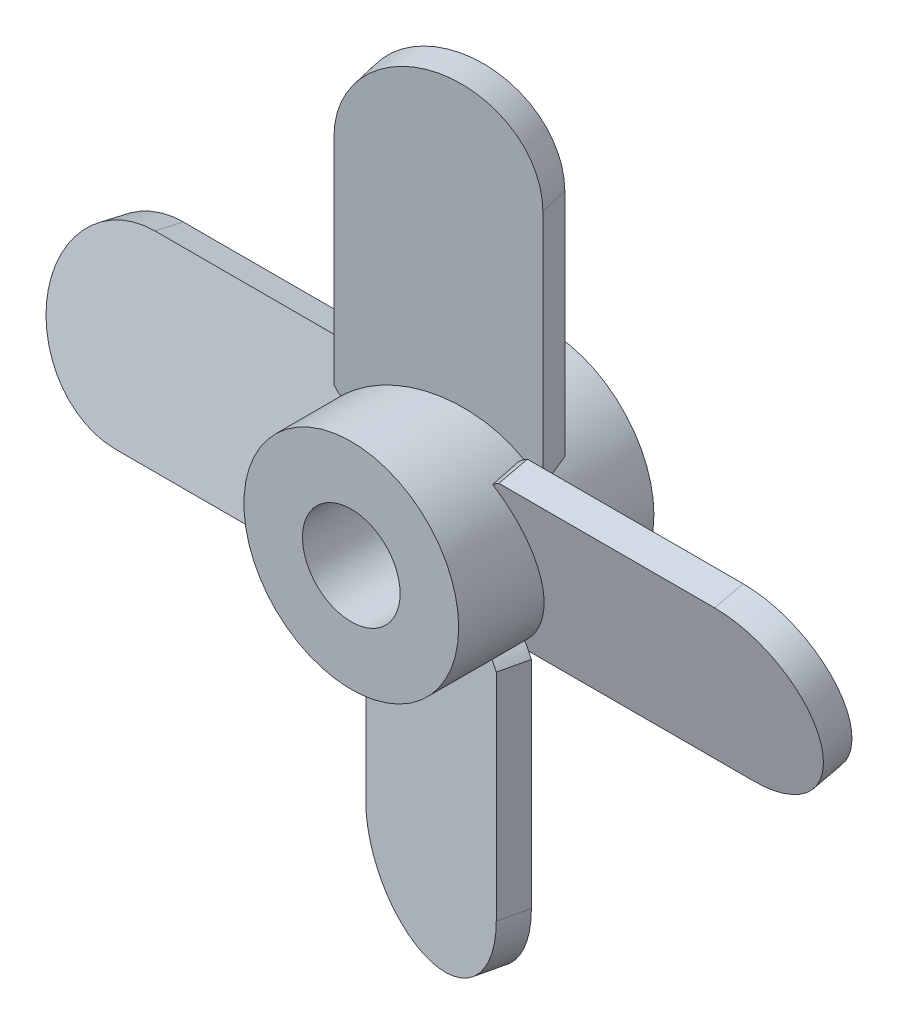
ISO-10303-21;
HEADER;
FILE_DESCRIPTION(('STEP AP214'),'2;1');
FILE_NAME('part.step','',(''),(''),'','','');
FILE_SCHEMA(('AUTOMOTIVE_DESIGN { 1 0 10303 214 1 1 1 1 }'));
ENDSEC;
DATA;
#1=APPLICATION_CONTEXT('core data for automotive mechanical design processes');
#2=APPLICATION_PROTOCOL_DEFINITION('international standard','automotive_design',2000,#1);
#3=PRODUCT_CONTEXT('',#1,'mechanical');
#4=PRODUCT('Part','Part','',(#3));
#5=PRODUCT_RELATED_PRODUCT_CATEGORY('part','',(#4));
#6=PRODUCT_DEFINITION_FORMATION('','',#4);
#7=PRODUCT_DEFINITION_CONTEXT('part definition',#1,'design');
#8=PRODUCT_DEFINITION('design','',#6,#7);
#9=PRODUCT_DEFINITION_SHAPE('','',#8);
#10=(LENGTH_UNIT() NAMED_UNIT(*) SI_UNIT(.MILLI.,.METRE.));
#11=(NAMED_UNIT(*) PLANE_ANGLE_UNIT() SI_UNIT($,.RADIAN.));
#12=(NAMED_UNIT(*) SI_UNIT($,.STERADIAN.) SOLID_ANGLE_UNIT());
#13=UNCERTAINTY_MEASURE_WITH_UNIT(LENGTH_MEASURE(1.E-05),#10,'distance_accuracy_value','');
#14=(GEOMETRIC_REPRESENTATION_CONTEXT(3) GLOBAL_UNCERTAINTY_ASSIGNED_CONTEXT((#13)) GLOBAL_UNIT_ASSIGNED_CONTEXT((#10,
#11,#12)) REPRESENTATION_CONTEXT('',''));
#15=CARTESIAN_POINT('',(0.,0.,0.));
#16=DIRECTION('',(0.,0.,1.));
#17=DIRECTION('',(1.,0.,0.));
#18=AXIS2_PLACEMENT_3D('',#15,#16,#17);
#19=CARTESIAN_POINT('',(0.,0.,10.));
#20=DIRECTION('',(0.,0.,-1.));
#21=DIRECTION('',(-1.,0.,0.));
#22=AXIS2_PLACEMENT_3D('',#19,#20,#21);
#23=CYLINDRICAL_SURFACE('',#22,5.5);
#24=CARTESIAN_POINT('',(0.,0.,4.23027191915496));
#25=DIRECTION('',(0.,0.224951054343859,0.974370064785237));
#26=DIRECTION('',(0.,0.974370064785237,-0.224951054343859));
#27=AXIS2_PLACEMENT_3D('',#24,#25,#26);
#28=ELLIPSE('',#27,5.64467259286365,5.5);
#29=CARTESIAN_POINT('',(-3.55411801171951,4.1974093389579,3.26122361765623));
#30=VERTEX_POINT('',#29);
#31=CARTESIAN_POINT('',(-3.72355133381853,-4.04785936815957,5.1647938894126));
#32=VERTEX_POINT('',#31);
#33=EDGE_CURVE('E401',#30,#32,#28,.T.);
#34=ORIENTED_EDGE('',*,*,#33,.F.);
#35=CARTESIAN_POINT('',(0.,0.,-14.9197536685354));
#36=DIRECTION('',(0.,-0.974370064785237,0.224951054343859));
#37=DIRECTION('',(0.,-0.224951054343859,-0.974370064785237));
#38=AXIS2_PLACEMENT_3D('',#35,#36,#37);
#39=ELLIPSE('',#38,24.4497631542226,5.5);
#40=CARTESIAN_POINT('',(-3.11211554643808,4.53483592047368,4.72277871483409));
#41=VERTEX_POINT('',#40);
#42=EDGE_CURVE('E468',#41,#30,#39,.T.);
#43=ORIENTED_EDGE('',*,*,#42,.F.);
#44=CARTESIAN_POINT('',(0.,0.,5.76972808084504));
#45=DIRECTION('',(0.,0.224951054343859,0.974370064785237));
#46=DIRECTION('',(0.,0.974370064785237,-0.224951054343859));
#47=AXIS2_PLACEMENT_3D('',#44,#45,#46);
#48=ELLIPSE('',#47,5.64467259286365,5.5);
#49=CARTESIAN_POINT('',(-3.90488134799597,-3.87322884143086,6.66393341728152));
#50=VERTEX_POINT('',#49);
#51=EDGE_CURVE('E474',#41,#50,#48,.T.);
#52=ORIENTED_EDGE('',*,*,#51,.T.);
#53=CARTESIAN_POINT('',(-3.72355133382234,-4.04785936815909,5.16479388941249));
#54=CARTESIAN_POINT('',(-3.75348131088161,-4.02036818114533,5.41487375804517));
#55=CARTESIAN_POINT('',(-3.7835571339256,-3.99207004374434,5.66484198635183));
#56=CARTESIAN_POINT('',(-3.8440004719824,-3.93385986816853,6.16455516230802));
#57=CARTESIAN_POINT('',(-3.8743679869952,-3.90394782999373,6.41430010995756));
#58=CARTESIAN_POINT('',(-3.90488134799271,-3.87322884143174,6.66393341728108));
#59=B_SPLINE_CURVE_WITH_KNOTS('',3,(#53,#54,#55,#56,#57,#58),.UNSPECIFIED.,.F.,.F.,(4,2,4),(0.,
0.760069137561964,1.52013827510843),.UNSPECIFIED.);
#60=EDGE_CURVE('E460',#32,#50,#59,.T.);
#61=ORIENTED_EDGE('',*,*,#60,.F.);
#62=EDGE_LOOP('',(#34,#43,#52,#61));
#63=FACE_BOUND('',#62,.T.);
#64=CARTESIAN_POINT('',(0.,0.,4.23027191915496));
#65=DIRECTION('',(0.,-0.224951054343859,0.974370064785237));
#66=DIRECTION('',(0.,-0.974370064785237,-0.224951054343859));
#67=AXIS2_PLACEMENT_3D('',#64,#65,#66);
#68=ELLIPSE('',#67,5.64467259286365,5.5);
#69=CARTESIAN_POINT('',(3.55411801171951,-4.1974093389579,3.26122361765623));
#70=VERTEX_POINT('',#69);
#71=CARTESIAN_POINT('',(3.72355133381853,4.04785936815957,5.1647938894126));
#72=VERTEX_POINT('',#71);
#73=EDGE_CURVE('E369',#70,#72,#68,.T.);
#74=ORIENTED_EDGE('',*,*,#73,.F.);
#75=CARTESIAN_POINT('',(0.,0.,-14.9197536685354));
#76=DIRECTION('',(0.,0.974370064785237,0.224951054343859));
#77=DIRECTION('',(0.,0.224951054343859,-0.974370064785237));
#78=AXIS2_PLACEMENT_3D('',#75,#76,#77);
#79=ELLIPSE('',#78,24.4497631542226,5.5);
#80=CARTESIAN_POINT('',(3.11211554643808,-4.53483592047368,4.72277871483409));
#81=VERTEX_POINT('',#80);
#82=EDGE_CURVE('E357',#81,#70,#79,.T.);
#83=ORIENTED_EDGE('',*,*,#82,.F.);
#84=CARTESIAN_POINT('',(0.,0.,5.76972808084504));
#85=DIRECTION('',(0.,-0.224951054343859,0.974370064785237));
#86=DIRECTION('',(0.,-0.974370064785237,-0.224951054343859));
#87=AXIS2_PLACEMENT_3D('',#84,#85,#86);
#88=ELLIPSE('',#87,5.64467259286365,5.5);
#89=CARTESIAN_POINT('',(3.90488134799597,3.87322884143086,6.66393341728152));
#90=VERTEX_POINT('',#89);
#91=EDGE_CURVE('E350',#81,#90,#88,.T.);
#92=ORIENTED_EDGE('',*,*,#91,.T.);
#93=CARTESIAN_POINT('',(3.15825577928342,4.50282360665204,0.));
#94=CARTESIAN_POINT('',(3.21604698998649,4.4622902514645,0.603670545481666));
#95=CARTESIAN_POINT('',(3.27743532968615,4.41757285724545,1.20670514379625));
#96=CARTESIAN_POINT('',(3.40578697882514,4.31939112203055,2.41145698837733));
#97=CARTESIAN_POINT('',(3.47275017791286,4.26592695415258,3.0131742604778));
#98=CARTESIAN_POINT('',(3.61058861075041,4.14990999872646,4.21486831362801));
#99=CARTESIAN_POINT('',(3.68146120086754,4.08736330740748,4.81484598894514));
#100=CARTESIAN_POINT('',(3.82538940954141,3.95298456782775,6.01349130874733));
#101=CARTESIAN_POINT('',(3.89844500514867,3.88115261715457,6.61215896693336));
#102=CARTESIAN_POINT('',(4.02869768610097,3.7451809219922,7.67582098414173));
#103=CARTESIAN_POINT('',(4.08582387901895,3.68286053910896,8.1410577301585));
#104=CARTESIAN_POINT('',(4.19945723026314,3.55275394490283,9.07096708838006));
#105=CARTESIAN_POINT('',(4.25596422404573,3.48496631891447,9.53563952279184));
#106=CARTESIAN_POINT('',(4.31172784279444,3.41452822651552,10.));
#107=B_SPLINE_CURVE_WITH_KNOTS('',3,(#93,#94,#95,#96,#97,#98,#99,#100,#101,#102,#103,#104,#105,
#106),.UNSPECIFIED.,.F.,.F.,(4,2,2,2,2,2,4),(0.,1.82331102579305,3.6465859686143,
5.46864273004729,7.29068034332047,8.70921606180222,10.1281200155259),.UNSPECIFIED.);
#108=EDGE_CURVE('E360',#72,#90,#107,.T.);
#109=ORIENTED_EDGE('',*,*,#108,.F.);
#110=EDGE_LOOP('',(#74,#83,#92,#109));
#111=FACE_BOUND('',#110,.T.);
#112=CARTESIAN_POINT('',(0.,0.,10.));
#113=DIRECTION('',(0.,0.,1.));
#114=DIRECTION('',(1.,0.,0.));
#115=AXIS2_PLACEMENT_3D('',#112,#113,#114);
#116=CIRCLE('',#115,5.5);
#117=CARTESIAN_POINT('',(5.5,0.,10.));
#118=VERTEX_POINT('',#117);
#119=EDGE_CURVE('E346',#118,#118,#116,.T.);
#120=ORIENTED_EDGE('',*,*,#119,.F.);
#121=EDGE_LOOP('',(#120));
#122=FACE_BOUND('',#121,.T.);
#123=CARTESIAN_POINT('',(0.,0.,0.));
#124=DIRECTION('',(0.,0.,1.));
#125=DIRECTION('',(1.,0.,0.));
#126=AXIS2_PLACEMENT_3D('',#123,#124,#125);
#127=CIRCLE('',#126,5.5);
#128=CARTESIAN_POINT('',(5.5,0.,0.));
#129=VERTEX_POINT('',#128);
#130=EDGE_CURVE('E342',#129,#129,#127,.T.);
#131=ORIENTED_EDGE('',*,*,#130,.T.);
#132=EDGE_LOOP('',(#131));
#133=FACE_BOUND('',#132,.T.);
#134=CARTESIAN_POINT('',(0.,0.,4.23027191915496));
#135=DIRECTION('',(0.224951054343859,0.,0.974370064785237));
#136=DIRECTION('',(0.974370064785237,0.,-0.224951054343859));
#137=AXIS2_PLACEMENT_3D('',#134,#135,#136);
#138=ELLIPSE('',#137,5.64467259286365,5.5);
#139=CARTESIAN_POINT('',(4.19740933895788,3.55411801171952,3.26122361765623));
#140=VERTEX_POINT('',#139);
#141=CARTESIAN_POINT('',(-4.04785936815849,3.72355133382412,5.16479388941235));
#142=VERTEX_POINT('',#141);
#143=EDGE_CURVE('E413',#140,#142,#138,.T.);
#144=ORIENTED_EDGE('',*,*,#143,.F.);
#145=CARTESIAN_POINT('',(0.,0.,-14.9197536685354));
#146=DIRECTION('',(-0.974370064785237,0.,0.224951054343859));
#147=DIRECTION('',(-0.224951054343859,0.,-0.974370064785237));
#148=AXIS2_PLACEMENT_3D('',#145,#146,#147);
#149=ELLIPSE('',#148,24.4497631542226,5.5);
#150=CARTESIAN_POINT('',(4.53483592047367,3.1121155464381,4.72277871483409));
#151=VERTEX_POINT('',#150);
#152=EDGE_CURVE('E482',#151,#140,#149,.T.);
#153=ORIENTED_EDGE('',*,*,#152,.F.);
#154=CARTESIAN_POINT('',(0.,0.,5.76972808084504));
#155=DIRECTION('',(0.224951054343859,0.,0.974370064785237));
#156=DIRECTION('',(0.974370064785237,0.,-0.224951054343859));
#157=AXIS2_PLACEMENT_3D('',#154,#155,#156);
#158=ELLIPSE('',#157,5.64467259286365,5.5);
#159=CARTESIAN_POINT('',(-3.8732288414298,3.90488134800023,6.66393341728127));
#160=VERTEX_POINT('',#159);
#161=EDGE_CURVE('E485',#151,#160,#158,.T.);
#162=ORIENTED_EDGE('',*,*,#161,.T.);
#163=CARTESIAN_POINT('',(-4.04785936815909,3.72355133382231,5.16479388941248));
#164=CARTESIAN_POINT('',(-4.02036818114533,3.75348131088159,5.41487375804516));
#165=CARTESIAN_POINT('',(-3.99207004374436,3.78355713392559,5.66484198635183));
#166=CARTESIAN_POINT('',(-3.93385986816854,3.84400047198239,6.16455516230802));
#167=CARTESIAN_POINT('',(-3.90394782999374,3.87436798699519,6.41430010995756));
#168=CARTESIAN_POINT('',(-3.87322884143175,3.9048813479927,6.66393341728108));
#169=B_SPLINE_CURVE_WITH_KNOTS('',3,(#163,#164,#165,#166,#167,#168),.UNSPECIFIED.,.F.,.F.,(4,2,
4),(0.,0.760069137561966,1.52013827510844),.UNSPECIFIED.);
#170=EDGE_CURVE('E478',#142,#160,#169,.T.);
#171=ORIENTED_EDGE('',*,*,#170,.F.);
#172=EDGE_LOOP('',(#144,#153,#162,#171));
#173=FACE_BOUND('',#172,.T.);
#174=CARTESIAN_POINT('',(0.,0.,4.23027191915496));
#175=DIRECTION('',(-0.224951054343859,0.,0.974370064785237));
#176=DIRECTION('',(-0.974370064785237,0.,-0.224951054343859));
#177=AXIS2_PLACEMENT_3D('',#174,#175,#176);
#178=ELLIPSE('',#177,5.64467259286365,5.5);
#179=CARTESIAN_POINT('',(-4.19740933895786,-3.55411801171955,3.26122361765623));
#180=VERTEX_POINT('',#179);
#181=CARTESIAN_POINT('',(4.04785936815961,-3.72355133381849,5.1647938894126));
#182=VERTEX_POINT('',#181);
#183=EDGE_CURVE('E11',#180,#182,#178,.T.);
#184=ORIENTED_EDGE('',*,*,#183,.F.);
#185=CARTESIAN_POINT('',(0.,0.,-14.9197536685354));
#186=DIRECTION('',(0.974370064785237,0.,0.224951054343859));
#187=DIRECTION('',(0.224951054343859,0.,-0.974370064785237));
#188=AXIS2_PLACEMENT_3D('',#185,#186,#187);
#189=ELLIPSE('',#188,24.4497631542226,5.5);
#190=CARTESIAN_POINT('',(-4.53483592047365,-3.11211554643813,4.72277871483409));
#191=VERTEX_POINT('',#190);
#192=EDGE_CURVE('E416',#191,#180,#189,.T.);
#193=ORIENTED_EDGE('',*,*,#192,.F.);
#194=CARTESIAN_POINT('',(0.,0.,5.76972808084504));
#195=DIRECTION('',(-0.224951054343859,0.,0.974370064785237));
#196=DIRECTION('',(-0.974370064785237,0.,-0.224951054343859));
#197=AXIS2_PLACEMENT_3D('',#194,#195,#196);
#198=ELLIPSE('',#197,5.64467259286365,5.5);
#199=CARTESIAN_POINT('',(3.87322884143091,-3.90488134799589,6.66393341728152));
#200=VERTEX_POINT('',#199);
#201=EDGE_CURVE('E417',#191,#200,#198,.T.);
#202=ORIENTED_EDGE('',*,*,#201,.T.);
#203=CARTESIAN_POINT('',(4.68435340712985,-2.88215772592589,-3.29935442105623));
#204=CARTESIAN_POINT('',(4.65809906632925,-2.92479515571133,-2.69367026656429));
#205=CARTESIAN_POINT('',(4.62813377924379,-2.972227295371,-2.08849850654429));
#206=CARTESIAN_POINT('',(4.56030066515629,-3.07530711591436,-0.879329298233434));
#207=CARTESIAN_POINT('',(4.52243326050215,-3.13095435767545,-0.275331788922555));
#208=CARTESIAN_POINT('',(4.43832157415249,-3.24908269565078,0.931274855997408));
#209=CARTESIAN_POINT('',(4.39207908922768,-3.31156232492316,1.53388426137879));
#210=CARTESIAN_POINT('',(4.29076073549829,-3.44182886676507,2.73779175307077));
#211=CARTESIAN_POINT('',(4.23568471037189,-3.50961587324517,3.33908981598444));
#212=CARTESIAN_POINT('',(4.09137354458682,-3.67798143134498,4.79186112359237));
#213=CARTESIAN_POINT('',(3.99749168969725,-3.78040538930177,5.64266200023275));
#214=CARTESIAN_POINT('',(3.79097364878478,-3.98746482523993,7.34172700200897));
#215=CARTESIAN_POINT('',(3.67833695859737,-4.0921003626066,8.18999105832623));
#216=CARTESIAN_POINT('',(3.43505136557553,-4.29835293575805,9.88422251755516));
#217=CARTESIAN_POINT('',(3.30440395758333,-4.39997022119994,10.7301901051321));
#218=CARTESIAN_POINT('',(3.02680650283894,-4.59534934550613,12.4203272689908));
#219=CARTESIAN_POINT('',(2.87985720327418,-4.68911154405817,13.2644969258736));
#220=CARTESIAN_POINT('',(2.69966997003275,-4.79194192801171,14.2522342754944));
#221=CARTESIAN_POINT('',(2.67315566544432,-4.80678380503987,14.3964488664013));
#222=CARTESIAN_POINT('',(2.61973698188673,-4.83610411501773,14.6848377573224));
#223=CARTESIAN_POINT('',(2.59283261586359,-4.85058255998626,14.8290120585127));
#224=CARTESIAN_POINT('',(2.56573981657003,-4.8648719606654,14.9731703291034));
#225=B_SPLINE_CURVE_WITH_KNOTS('',3,(#203,#204,#205,#206,#207,#208,#209,#210,#211,#212,#213,
#214,#215,#216,#217,#218,#219,#220,#221,#222,#223,#224),.UNSPECIFIED.,.F.,.F.,(4,2,2,2,2,2,2,2,
2,2,4),(0.,1.82320082733537,3.64630423421157,5.46901697893325,7.29176198266288,9.87774312115176,
12.463793786803,15.0496299461255,17.6353476341278,18.0774900785285,18.5196178817925),.UNSPECIFIED.);
#226=EDGE_CURVE('E48',#182,#200,#225,.T.);
#227=ORIENTED_EDGE('',*,*,#226,.F.);
#228=EDGE_LOOP('',(#184,#193,#202,#227));
#229=FACE_BOUND('',#228,.T.);
#230=ADVANCED_FACE('F39',(#63,#111,#122,#133,#173,#229),#23,.T.);
#231=CARTESIAN_POINT('',(0.,0.,10.));
#232=DIRECTION('',(0.,0.,1.));
#233=DIRECTION('',(1.,0.,0.));
#234=AXIS2_PLACEMENT_3D('',#231,#232,#233);
#235=PLANE('',#234);
#236=ORIENTED_EDGE('',*,*,#119,.T.);
#237=EDGE_LOOP('',(#236));
#238=FACE_BOUND('',#237,.T.);
#239=CARTESIAN_POINT('',(0.,0.,10.));
#240=DIRECTION('',(0.,0.,1.));
#241=DIRECTION('',(1.,0.,0.));
#242=AXIS2_PLACEMENT_3D('',#239,#240,#241);
#243=CIRCLE('',#242,2.5);
#244=CARTESIAN_POINT('',(2.5,0.,10.));
#245=VERTEX_POINT('',#244);
#246=EDGE_CURVE('E338',#245,#245,#243,.T.);
#247=ORIENTED_EDGE('',*,*,#246,.F.);
#248=EDGE_LOOP('',(#247));
#249=FACE_BOUND('',#248,.T.);
#250=ADVANCED_FACE('F384',(#238,#249),#235,.T.);
#251=CARTESIAN_POINT('',(0.,0.,0.));
#252=DIRECTION('',(0.,0.,1.));
#253=DIRECTION('',(1.,0.,0.));
#254=AXIS2_PLACEMENT_3D('',#251,#252,#253);
#255=PLANE('',#254);
#256=ORIENTED_EDGE('',*,*,#130,.F.);
#257=EDGE_LOOP('',(#256));
#258=FACE_BOUND('',#257,.T.);
#259=CARTESIAN_POINT('',(0.,0.,0.));
#260=DIRECTION('',(0.,0.,1.));
#261=DIRECTION('',(1.,0.,0.));
#262=AXIS2_PLACEMENT_3D('',#259,#260,#261);
#263=CIRCLE('',#262,2.5);
#264=CARTESIAN_POINT('',(2.5,0.,0.));
#265=VERTEX_POINT('',#264);
#266=EDGE_CURVE('E337',#265,#265,#263,.T.);
#267=ORIENTED_EDGE('',*,*,#266,.T.);
#268=EDGE_LOOP('',(#267));
#269=FACE_BOUND('',#268,.T.);
#270=ADVANCED_FACE('F382',(#258,#269),#255,.F.);
#271=CARTESIAN_POINT('',(0.,0.,10.));
#272=DIRECTION('',(0.,0.,-1.));
#273=DIRECTION('',(-1.,0.,0.));
#274=AXIS2_PLACEMENT_3D('',#271,#272,#273);
#275=CYLINDRICAL_SURFACE('',#274,2.5);
#276=ORIENTED_EDGE('',*,*,#246,.T.);
#277=EDGE_LOOP('',(#276));
#278=FACE_BOUND('',#277,.T.);
#279=ORIENTED_EDGE('',*,*,#266,.F.);
#280=EDGE_LOOP('',(#279));
#281=FACE_BOUND('',#280,.T.);
#282=ADVANCED_FACE('F377',(#278,#281),#275,.F.);
#283=CARTESIAN_POINT('',(6.28112996572833,1.52053642832671,4.58131541390326));
#284=DIRECTION('',(0.,-0.224951054343859,0.974370064785237));
#285=DIRECTION('',(0.,-0.974370064785237,-0.224951054343859));
#286=AXIS2_PLACEMENT_3D('',#283,#284,#285);
#287=CYLINDRICAL_SURFACE('',#286,3.64266617081056);
#288=CARTESIAN_POINT('',(6.28112996572833,1.52053642832671,4.58131541390326));
#289=DIRECTION('',(0.,0.224951054343859,-0.974370064785237));
#290=DIRECTION('',(0.,0.974370064785237,0.224951054343859));
#291=AXIS2_PLACEMENT_3D('',#288,#289,#290);
#292=CIRCLE('',#291,3.64266617081056);
#293=CARTESIAN_POINT('',(4.28936229682364,4.49226583197174,5.26739320583742));
#294=VERTEX_POINT('',#293);
#295=EDGE_CURVE('E300',#72,#294,#292,.T.);
#296=ORIENTED_EDGE('',*,*,#295,.F.);
#297=ORIENTED_EDGE('',*,*,#108,.T.);
#298=CARTESIAN_POINT('',(6.28112996572833,1.18310984681092,6.04287051108112));
#299=DIRECTION('',(0.,0.224951054343859,-0.974370064785237));
#300=DIRECTION('',(0.,0.974370064785237,0.224951054343859));
#301=AXIS2_PLACEMENT_3D('',#298,#299,#300);
#302=CIRCLE('',#301,3.64266617081056);
#303=CARTESIAN_POINT('',(4.28936229682364,4.15483925045595,6.72894830301527));
#304=VERTEX_POINT('',#303);
#305=EDGE_CURVE('E299',#90,#304,#302,.T.);
#306=ORIENTED_EDGE('',*,*,#305,.T.);
#307=DIRECTION('',(0.,-0.224951054343859,0.974370064785237));
#308=VECTOR('',#307,1.);
#309=CARTESIAN_POINT('',(4.28936229682364,4.49226583197174,5.26739320583742));
#310=LINE('',#309,#308);
#311=EDGE_CURVE('E333',#294,#304,#310,.T.);
#312=ORIENTED_EDGE('',*,*,#311,.F.);
#313=EDGE_LOOP('',(#296,#297,#306,#312));
#314=FACE_BOUND('',#313,.T.);
#315=ADVANCED_FACE('F371',(#314),#287,.T.);
#316=CARTESIAN_POINT('',(4.28936229682364,4.49226583197174,5.26739320583742));
#317=DIRECTION('',(0.,-0.974370064785237,-0.224951054343859));
#318=DIRECTION('',(0.,0.224951054343859,-0.974370064785237));
#319=AXIS2_PLACEMENT_3D('',#316,#317,#318);
#320=PLANE('',#319);
#321=DIRECTION('',(1.,0.,0.));
#322=VECTOR('',#321,1.);
#323=CARTESIAN_POINT('',(4.28936229682364,4.15483925045595,6.72894830301527));
#324=LINE('',#323,#322);
#325=CARTESIAN_POINT('',(15.3387412463815,4.15483925045595,6.72894830301527));
#326=VERTEX_POINT('',#325);
#327=EDGE_CURVE('E317',#304,#326,#324,.T.);
#328=ORIENTED_EDGE('',*,*,#327,.T.);
#329=DIRECTION('',(0.,-0.224951054343859,0.974370064785237));
#330=VECTOR('',#329,1.);
#331=CARTESIAN_POINT('',(15.3387412463815,4.49226583197174,5.26739320583742));
#332=LINE('',#331,#330);
#333=CARTESIAN_POINT('',(15.3387412463815,4.49226583197174,5.26739320583742));
#334=VERTEX_POINT('',#333);
#335=EDGE_CURVE('E329',#334,#326,#332,.T.);
#336=ORIENTED_EDGE('',*,*,#335,.F.);
#337=DIRECTION('',(1.,0.,0.));
#338=VECTOR('',#337,1.);
#339=CARTESIAN_POINT('',(4.28936229682364,4.49226583197174,5.26739320583742));
#340=LINE('',#339,#338);
#341=EDGE_CURVE('E303',#294,#334,#340,.T.);
#342=ORIENTED_EDGE('',*,*,#341,.F.);
#343=ORIENTED_EDGE('',*,*,#311,.T.);
#344=EDGE_LOOP('',(#328,#336,#342,#343));
#345=FACE_BOUND('',#344,.T.);
#346=ADVANCED_FACE('F376',(#345),#320,.F.);
#347=CARTESIAN_POINT('',(15.3387412463815,0.14742824650692,4.26430841174682));
#348=DIRECTION('',(0.,-0.224951054343859,0.974370064785237));
#349=DIRECTION('',(0.,-0.974370064785237,-0.224951054343859));
#350=AXIS2_PLACEMENT_3D('',#347,#348,#349);
#351=CYLINDRICAL_SURFACE('',#350,4.45912466165765);
#352=CARTESIAN_POINT('',(15.3387412463815,-0.189998335008868,5.72586350892468));
#353=DIRECTION('',(0.,0.224951054343859,-0.974370064785237));
#354=DIRECTION('',(0.,0.974370064785237,0.224951054343859));
#355=AXIS2_PLACEMENT_3D('',#352,#353,#354);
#356=CIRCLE('',#355,4.45912466165765);
#357=CARTESIAN_POINT('',(15.3387412463815,-4.53483592047368,4.72277871483409));
#358=VERTEX_POINT('',#357);
#359=EDGE_CURVE('E320',#326,#358,#356,.T.);
#360=ORIENTED_EDGE('',*,*,#359,.T.);
#361=DIRECTION('',(0.,-0.224951054343859,0.974370064785237));
#362=VECTOR('',#361,1.);
#363=CARTESIAN_POINT('',(15.3387412463815,-4.1974093389579,3.26122361765623));
#364=LINE('',#363,#362);
#365=CARTESIAN_POINT('',(15.3387412463815,-4.1974093389579,3.26122361765623));
#366=VERTEX_POINT('',#365);
#367=EDGE_CURVE('E314',#366,#358,#364,.T.);
#368=ORIENTED_EDGE('',*,*,#367,.F.);
#369=CARTESIAN_POINT('',(15.3387412463815,0.14742824650692,4.26430841174682));
#370=DIRECTION('',(0.,0.224951054343859,-0.974370064785237));
#371=DIRECTION('',(0.,0.974370064785237,0.224951054343859));
#372=AXIS2_PLACEMENT_3D('',#369,#370,#371);
#373=CIRCLE('',#372,4.45912466165765);
#374=EDGE_CURVE('E307',#334,#366,#373,.T.);
#375=ORIENTED_EDGE('',*,*,#374,.F.);
#376=ORIENTED_EDGE('',*,*,#335,.T.);
#377=EDGE_LOOP('',(#360,#368,#375,#376));
#378=FACE_BOUND('',#377,.T.);
#379=ADVANCED_FACE('F505',(#378),#351,.T.);
#380=CARTESIAN_POINT('',(3.07222971425247,-4.1974093389579,3.26122361765623));
#381=DIRECTION('',(0.,0.974370064785237,0.224951054343859));
#382=DIRECTION('',(0.,-0.224951054343859,0.974370064785237));
#383=AXIS2_PLACEMENT_3D('',#380,#381,#382);
#384=PLANE('',#383);
#385=DIRECTION('',(-1.,0.,0.));
#386=VECTOR('',#385,1.);
#387=CARTESIAN_POINT('',(3.07222971425247,-4.53483592047368,4.72277871483409));
#388=LINE('',#387,#386);
#389=EDGE_CURVE('E304',#358,#81,#388,.T.);
#390=ORIENTED_EDGE('',*,*,#389,.T.);
#391=ORIENTED_EDGE('',*,*,#82,.T.);
#392=DIRECTION('',(-1.,0.,0.));
#393=VECTOR('',#392,1.);
#394=CARTESIAN_POINT('',(3.07222971425247,-4.1974093389579,3.26122361765623));
#395=LINE('',#394,#393);
#396=EDGE_CURVE('E310',#366,#70,#395,.T.);
#397=ORIENTED_EDGE('',*,*,#396,.F.);
#398=ORIENTED_EDGE('',*,*,#367,.T.);
#399=EDGE_LOOP('',(#390,#391,#397,#398));
#400=FACE_BOUND('',#399,.T.);
#401=ADVANCED_FACE('F501',(#400),#384,.F.);
#402=CARTESIAN_POINT('',(1.21343901278345,-2.231332380472,3.71512824867551));
#403=DIRECTION('',(0.,-0.224951054343859,0.974370064785237));
#404=DIRECTION('',(0.,-0.974370064785237,-0.224951054343859));
#405=AXIS2_PLACEMENT_3D('',#402,#403,#404);
#406=PLANE('',#405);
#407=ORIENTED_EDGE('',*,*,#396,.T.);
#408=ORIENTED_EDGE('',*,*,#73,.T.);
#409=ORIENTED_EDGE('',*,*,#295,.T.);
#410=ORIENTED_EDGE('',*,*,#341,.T.);
#411=ORIENTED_EDGE('',*,*,#374,.T.);
#412=EDGE_LOOP('',(#407,#408,#409,#410,#411));
#413=FACE_BOUND('',#412,.T.);
#414=ADVANCED_FACE('F491',(#413),#406,.F.);
#415=CARTESIAN_POINT('',(1.21343901278345,-2.56875896198779,5.17668334585336));
#416=DIRECTION('',(0.,-0.224951054343859,0.974370064785237));
#417=DIRECTION('',(0.,-0.974370064785237,-0.224951054343859));
#418=AXIS2_PLACEMENT_3D('',#415,#416,#417);
#419=PLANE('',#418);
#420=ORIENTED_EDGE('',*,*,#91,.F.);
#421=ORIENTED_EDGE('',*,*,#389,.F.);
#422=ORIENTED_EDGE('',*,*,#359,.F.);
#423=ORIENTED_EDGE('',*,*,#327,.F.);
#424=ORIENTED_EDGE('',*,*,#305,.F.);
#425=EDGE_LOOP('',(#420,#421,#422,#423,#424));
#426=FACE_BOUND('',#425,.T.);
#427=ADVANCED_FACE('F497',(#426),#419,.T.);
#428=CARTESIAN_POINT('',(-1.52053642832673,6.28112996572833,4.58131541390326));
#429=DIRECTION('',(0.224951054343859,0.,0.974370064785237));
#430=DIRECTION('',(0.974370064785237,0.,-0.224951054343859));
#431=AXIS2_PLACEMENT_3D('',#428,#429,#430);
#432=CYLINDRICAL_SURFACE('',#431,3.64266617081056);
#433=CARTESIAN_POINT('',(-1.52053642832673,6.28112996572833,4.58131541390326));
#434=DIRECTION('',(-0.224951054343859,0.,-0.974370064785237));
#435=DIRECTION('',(-0.974370064785237,0.,0.224951054343859));
#436=AXIS2_PLACEMENT_3D('',#433,#434,#435);
#437=CIRCLE('',#436,3.64266617081056);
#438=CARTESIAN_POINT('',(-4.49226583197175,4.28936229682362,5.26739320583742));
#439=VERTEX_POINT('',#438);
#440=EDGE_CURVE('E262',#142,#439,#437,.T.);
#441=ORIENTED_EDGE('',*,*,#440,.F.);
#442=ORIENTED_EDGE('',*,*,#170,.T.);
#443=CARTESIAN_POINT('',(-1.18310984681094,6.28112996572833,6.04287051108112));
#444=DIRECTION('',(-0.224951054343859,0.,-0.974370064785237));
#445=DIRECTION('',(-0.974370064785237,0.,0.224951054343859));
#446=AXIS2_PLACEMENT_3D('',#443,#444,#445);
#447=CIRCLE('',#446,3.64266617081056);
#448=CARTESIAN_POINT('',(-4.15483925045596,4.28936229682363,6.72894830301527));
#449=VERTEX_POINT('',#448);
#450=EDGE_CURVE('E261',#160,#449,#447,.T.);
#451=ORIENTED_EDGE('',*,*,#450,.T.);
#452=DIRECTION('',(0.224951054343859,0.,0.974370064785237));
#453=VECTOR('',#452,1.);
#454=CARTESIAN_POINT('',(-4.49226583197175,4.28936229682362,5.26739320583742));
#455=LINE('',#454,#453);
#456=EDGE_CURVE('E295',#439,#449,#455,.T.);
#457=ORIENTED_EDGE('',*,*,#456,.F.);
#458=EDGE_LOOP('',(#441,#442,#451,#457));
#459=FACE_BOUND('',#458,.T.);
#460=ADVANCED_FACE('F519',(#459),#432,.T.);
#461=CARTESIAN_POINT('',(-4.49226583197175,4.28936229682362,5.26739320583742));
#462=DIRECTION('',(0.974370064785237,0.,-0.224951054343859));
#463=DIRECTION('',(-0.224951054343859,0.,-0.974370064785237));
#464=AXIS2_PLACEMENT_3D('',#461,#462,#463);
#465=PLANE('',#464);
#466=DIRECTION('',(0.,1.,0.));
#467=VECTOR('',#466,1.);
#468=CARTESIAN_POINT('',(-4.15483925045596,4.28936229682363,6.72894830301527));
#469=LINE('',#468,#467);
#470=CARTESIAN_POINT('',(-4.154839250456,15.3387412463814,6.72894830301527));
#471=VERTEX_POINT('',#470);
#472=EDGE_CURVE('E279',#449,#471,#469,.T.);
#473=ORIENTED_EDGE('',*,*,#472,.T.);
#474=DIRECTION('',(0.224951054343859,0.,0.974370064785237));
#475=VECTOR('',#474,1.);
#476=CARTESIAN_POINT('',(-4.49226583197179,15.3387412463814,5.26739320583742));
#477=LINE('',#476,#475);
#478=CARTESIAN_POINT('',(-4.49226583197179,15.3387412463814,5.26739320583742));
#479=VERTEX_POINT('',#478);
#480=EDGE_CURVE('E291',#479,#471,#477,.T.);
#481=ORIENTED_EDGE('',*,*,#480,.F.);
#482=DIRECTION('',(0.,1.,0.));
#483=VECTOR('',#482,1.);
#484=CARTESIAN_POINT('',(-4.49226583197175,4.28936229682362,5.26739320583742));
#485=LINE('',#484,#483);
#486=EDGE_CURVE('E265',#439,#479,#485,.T.);
#487=ORIENTED_EDGE('',*,*,#486,.F.);
#488=ORIENTED_EDGE('',*,*,#456,.T.);
#489=EDGE_LOOP('',(#473,#481,#487,#488));
#490=FACE_BOUND('',#489,.T.);
#491=ADVANCED_FACE('F525',(#490),#465,.F.);
#492=CARTESIAN_POINT('',(-0.147428246506974,15.3387412463815,4.26430841174682));
#493=DIRECTION('',(0.224951054343859,0.,0.974370064785237));
#494=DIRECTION('',(0.974370064785237,0.,-0.224951054343859));
#495=AXIS2_PLACEMENT_3D('',#492,#493,#494);
#496=CYLINDRICAL_SURFACE('',#495,4.45912466165765);
#497=CARTESIAN_POINT('',(0.189998335008815,15.3387412463815,5.72586350892468));
#498=DIRECTION('',(-0.224951054343859,0.,-0.974370064785237));
#499=DIRECTION('',(-0.974370064785237,0.,0.224951054343859));
#500=AXIS2_PLACEMENT_3D('',#497,#498,#499);
#501=CIRCLE('',#500,4.45912466165765);
#502=CARTESIAN_POINT('',(4.53483592047363,15.3387412463815,4.72277871483409));
#503=VERTEX_POINT('',#502);
#504=EDGE_CURVE('E282',#471,#503,#501,.T.);
#505=ORIENTED_EDGE('',*,*,#504,.T.);
#506=DIRECTION('',(0.224951054343859,0.,0.974370064785237));
#507=VECTOR('',#506,1.);
#508=CARTESIAN_POINT('',(4.19740933895784,15.3387412463815,3.26122361765623));
#509=LINE('',#508,#507);
#510=CARTESIAN_POINT('',(4.19740933895784,15.3387412463815,3.26122361765623));
#511=VERTEX_POINT('',#510);
#512=EDGE_CURVE('E276',#511,#503,#509,.T.);
#513=ORIENTED_EDGE('',*,*,#512,.F.);
#514=CARTESIAN_POINT('',(-0.147428246506974,15.3387412463815,4.26430841174682));
#515=DIRECTION('',(-0.224951054343859,0.,-0.974370064785237));
#516=DIRECTION('',(-0.974370064785237,0.,0.224951054343859));
#517=AXIS2_PLACEMENT_3D('',#514,#515,#516);
#518=CIRCLE('',#517,4.45912466165765);
#519=EDGE_CURVE('E269',#479,#511,#518,.T.);
#520=ORIENTED_EDGE('',*,*,#519,.F.);
#521=ORIENTED_EDGE('',*,*,#480,.T.);
#522=EDGE_LOOP('',(#505,#513,#520,#521));
#523=FACE_BOUND('',#522,.T.);
#524=ADVANCED_FACE('F533',(#523),#496,.T.);
#525=CARTESIAN_POINT('',(4.19740933895788,3.07222971425249,3.26122361765623));
#526=DIRECTION('',(-0.974370064785237,0.,0.224951054343859));
#527=DIRECTION('',(0.224951054343859,0.,0.974370064785237));
#528=AXIS2_PLACEMENT_3D('',#525,#526,#527);
#529=PLANE('',#528);
#530=DIRECTION('',(0.,-1.,0.));
#531=VECTOR('',#530,1.);
#532=CARTESIAN_POINT('',(4.53483592047367,3.07222971425249,4.72277871483409));
#533=LINE('',#532,#531);
#534=EDGE_CURVE('E266',#503,#151,#533,.T.);
#535=ORIENTED_EDGE('',*,*,#534,.T.);
#536=ORIENTED_EDGE('',*,*,#152,.T.);
#537=DIRECTION('',(0.,-1.,0.));
#538=VECTOR('',#537,1.);
#539=CARTESIAN_POINT('',(4.19740933895788,3.07222971425249,3.26122361765623));
#540=LINE('',#539,#538);
#541=EDGE_CURVE('E272',#511,#140,#540,.T.);
#542=ORIENTED_EDGE('',*,*,#541,.F.);
#543=ORIENTED_EDGE('',*,*,#512,.T.);
#544=EDGE_LOOP('',(#535,#536,#542,#543));
#545=FACE_BOUND('',#544,.T.);
#546=ADVANCED_FACE('F537',(#545),#529,.F.);
#547=CARTESIAN_POINT('',(2.231332380472,1.21343901278346,3.71512824867551));
#548=DIRECTION('',(0.224951054343859,0.,0.974370064785237));
#549=DIRECTION('',(0.974370064785237,0.,-0.224951054343859));
#550=AXIS2_PLACEMENT_3D('',#547,#548,#549);
#551=PLANE('',#550);
#552=ORIENTED_EDGE('',*,*,#541,.T.);
#553=ORIENTED_EDGE('',*,*,#143,.T.);
#554=ORIENTED_EDGE('',*,*,#440,.T.);
#555=ORIENTED_EDGE('',*,*,#486,.T.);
#556=ORIENTED_EDGE('',*,*,#519,.T.);
#557=EDGE_LOOP('',(#552,#553,#554,#555,#556));
#558=FACE_BOUND('',#557,.T.);
#559=ADVANCED_FACE('F457',(#558),#551,.F.);
#560=CARTESIAN_POINT('',(2.56875896198779,1.21343901278346,5.17668334585336));
#561=DIRECTION('',(0.224951054343859,0.,0.974370064785237));
#562=DIRECTION('',(0.974370064785237,0.,-0.224951054343859));
#563=AXIS2_PLACEMENT_3D('',#560,#561,#562);
#564=PLANE('',#563);
#565=ORIENTED_EDGE('',*,*,#161,.F.);
#566=ORIENTED_EDGE('',*,*,#534,.F.);
#567=ORIENTED_EDGE('',*,*,#504,.F.);
#568=ORIENTED_EDGE('',*,*,#472,.F.);
#569=ORIENTED_EDGE('',*,*,#450,.F.);
#570=EDGE_LOOP('',(#565,#566,#567,#568,#569));
#571=FACE_BOUND('',#570,.T.);
#572=ADVANCED_FACE('F455',(#571),#564,.T.);
#573=CARTESIAN_POINT('',(-6.28112996572833,-1.52053642832671,4.58131541390326));
#574=DIRECTION('',(0.,0.224951054343859,0.974370064785237));
#575=DIRECTION('',(0.,-0.974370064785237,0.224951054343859));
#576=AXIS2_PLACEMENT_3D('',#573,#574,#575);
#577=CYLINDRICAL_SURFACE('',#576,3.64266617081056);
#578=CARTESIAN_POINT('',(-6.28112996572833,-1.52053642832671,4.58131541390326));
#579=DIRECTION('',(0.,-0.224951054343859,-0.974370064785237));
#580=DIRECTION('',(0.,-0.974370064785237,0.224951054343859));
#581=AXIS2_PLACEMENT_3D('',#578,#579,#580);
#582=CIRCLE('',#581,3.64266617081056);
#583=CARTESIAN_POINT('',(-4.28936229682364,-4.49226583197174,5.26739320583742));
#584=VERTEX_POINT('',#583);
#585=EDGE_CURVE('E224',#32,#584,#582,.T.);
#586=ORIENTED_EDGE('',*,*,#585,.F.);
#587=ORIENTED_EDGE('',*,*,#60,.T.);
#588=CARTESIAN_POINT('',(-6.28112996572833,-1.18310984681092,6.04287051108112));
#589=DIRECTION('',(0.,-0.224951054343859,-0.974370064785237));
#590=DIRECTION('',(0.,-0.974370064785237,0.224951054343859));
#591=AXIS2_PLACEMENT_3D('',#588,#589,#590);
#592=CIRCLE('',#591,3.64266617081056);
#593=CARTESIAN_POINT('',(-4.28936229682364,-4.15483925045595,6.72894830301527));
#594=VERTEX_POINT('',#593);
#595=EDGE_CURVE('E63',#50,#594,#592,.T.);
#596=ORIENTED_EDGE('',*,*,#595,.T.);
#597=DIRECTION('',(0.,0.224951054343859,0.974370064785237));
#598=VECTOR('',#597,1.);
#599=CARTESIAN_POINT('',(-4.28936229682364,-4.49226583197174,5.26739320583742));
#600=LINE('',#599,#598);
#601=EDGE_CURVE('E257',#584,#594,#600,.T.);
#602=ORIENTED_EDGE('',*,*,#601,.F.);
#603=EDGE_LOOP('',(#586,#587,#596,#602));
#604=FACE_BOUND('',#603,.T.);
#605=ADVANCED_FACE('F450',(#604),#577,.T.);
#606=CARTESIAN_POINT('',(-4.28936229682364,-4.49226583197174,5.26739320583742));
#607=DIRECTION('',(0.,0.974370064785237,-0.224951054343859));
#608=DIRECTION('',(0.,0.224951054343859,0.974370064785237));
#609=AXIS2_PLACEMENT_3D('',#606,#607,#608);
#610=PLANE('',#609);
#611=DIRECTION('',(-1.,0.,0.));
#612=VECTOR('',#611,1.);
#613=CARTESIAN_POINT('',(-4.28936229682364,-4.15483925045595,6.72894830301527));
#614=LINE('',#613,#612);
#615=CARTESIAN_POINT('',(-15.3387412463815,-4.15483925045595,6.72894830301527));
#616=VERTEX_POINT('',#615);
#617=EDGE_CURVE('E241',#594,#616,#614,.T.);
#618=ORIENTED_EDGE('',*,*,#617,.T.);
#619=DIRECTION('',(0.,0.224951054343859,0.974370064785237));
#620=VECTOR('',#619,1.);
#621=CARTESIAN_POINT('',(-15.3387412463815,-4.49226583197174,5.26739320583742));
#622=LINE('',#621,#620);
#623=CARTESIAN_POINT('',(-15.3387412463815,-4.49226583197174,5.26739320583742));
#624=VERTEX_POINT('',#623);
#625=EDGE_CURVE('E253',#624,#616,#622,.T.);
#626=ORIENTED_EDGE('',*,*,#625,.F.);
#627=DIRECTION('',(-1.,0.,0.));
#628=VECTOR('',#627,1.);
#629=CARTESIAN_POINT('',(-4.28936229682364,-4.49226583197174,5.26739320583742));
#630=LINE('',#629,#628);
#631=EDGE_CURVE('E227',#584,#624,#630,.T.);
#632=ORIENTED_EDGE('',*,*,#631,.F.);
#633=ORIENTED_EDGE('',*,*,#601,.T.);
#634=EDGE_LOOP('',(#618,#626,#632,#633));
#635=FACE_BOUND('',#634,.T.);
#636=ADVANCED_FACE('F446',(#635),#610,.F.);
#637=CARTESIAN_POINT('',(-15.3387412463815,-0.14742824650692,4.26430841174682));
#638=DIRECTION('',(0.,0.224951054343859,0.974370064785237));
#639=DIRECTION('',(0.,-0.974370064785237,0.224951054343859));
#640=AXIS2_PLACEMENT_3D('',#637,#638,#639);
#641=CYLINDRICAL_SURFACE('',#640,4.45912466165765);
#642=CARTESIAN_POINT('',(-15.3387412463815,0.189998335008868,5.72586350892468));
#643=DIRECTION('',(0.,-0.224951054343859,-0.974370064785237));
#644=DIRECTION('',(0.,-0.974370064785237,0.224951054343859));
#645=AXIS2_PLACEMENT_3D('',#642,#643,#644);
#646=CIRCLE('',#645,4.45912466165765);
#647=CARTESIAN_POINT('',(-15.3387412463815,4.53483592047368,4.72277871483409));
#648=VERTEX_POINT('',#647);
#649=EDGE_CURVE('E244',#616,#648,#646,.T.);
#650=ORIENTED_EDGE('',*,*,#649,.T.);
#651=DIRECTION('',(0.,0.224951054343859,0.974370064785237));
#652=VECTOR('',#651,1.);
#653=CARTESIAN_POINT('',(-15.3387412463815,4.1974093389579,3.26122361765623));
#654=LINE('',#653,#652);
#655=CARTESIAN_POINT('',(-15.3387412463815,4.1974093389579,3.26122361765623));
#656=VERTEX_POINT('',#655);
#657=EDGE_CURVE('E238',#656,#648,#654,.T.);
#658=ORIENTED_EDGE('',*,*,#657,.F.);
#659=CARTESIAN_POINT('',(-15.3387412463815,-0.14742824650692,4.26430841174682));
#660=DIRECTION('',(0.,-0.224951054343859,-0.974370064785237));
#661=DIRECTION('',(0.,-0.974370064785237,0.224951054343859));
#662=AXIS2_PLACEMENT_3D('',#659,#660,#661);
#663=CIRCLE('',#662,4.45912466165765);
#664=EDGE_CURVE('E231',#624,#656,#663,.T.);
#665=ORIENTED_EDGE('',*,*,#664,.F.);
#666=ORIENTED_EDGE('',*,*,#625,.T.);
#667=EDGE_LOOP('',(#650,#658,#665,#666));
#668=FACE_BOUND('',#667,.T.);
#669=ADVANCED_FACE('F442',(#668),#641,.T.);
#670=CARTESIAN_POINT('',(-3.07222971425247,4.1974093389579,3.26122361765623));
#671=DIRECTION('',(0.,-0.974370064785237,0.224951054343859));
#672=DIRECTION('',(0.,-0.224951054343859,-0.974370064785237));
#673=AXIS2_PLACEMENT_3D('',#670,#671,#672);
#674=PLANE('',#673);
#675=DIRECTION('',(1.,0.,0.));
#676=VECTOR('',#675,1.);
#677=CARTESIAN_POINT('',(-3.07222971425247,4.53483592047368,4.72277871483409));
#678=LINE('',#677,#676);
#679=EDGE_CURVE('E228',#648,#41,#678,.T.);
#680=ORIENTED_EDGE('',*,*,#679,.T.);
#681=ORIENTED_EDGE('',*,*,#42,.T.);
#682=DIRECTION('',(1.,0.,0.));
#683=VECTOR('',#682,1.);
#684=CARTESIAN_POINT('',(-3.07222971425247,4.1974093389579,3.26122361765623));
#685=LINE('',#684,#683);
#686=EDGE_CURVE('E234',#656,#30,#685,.T.);
#687=ORIENTED_EDGE('',*,*,#686,.F.);
#688=ORIENTED_EDGE('',*,*,#657,.T.);
#689=EDGE_LOOP('',(#680,#681,#687,#688));
#690=FACE_BOUND('',#689,.T.);
#691=ADVANCED_FACE('F436',(#690),#674,.F.);
#692=CARTESIAN_POINT('',(-1.21343901278345,2.231332380472,3.71512824867551));
#693=DIRECTION('',(0.,0.224951054343859,0.974370064785237));
#694=DIRECTION('',(0.,0.974370064785237,-0.224951054343859));
#695=AXIS2_PLACEMENT_3D('',#692,#693,#694);
#696=PLANE('',#695);
#697=ORIENTED_EDGE('',*,*,#686,.T.);
#698=ORIENTED_EDGE('',*,*,#33,.T.);
#699=ORIENTED_EDGE('',*,*,#585,.T.);
#700=ORIENTED_EDGE('',*,*,#631,.T.);
#701=ORIENTED_EDGE('',*,*,#664,.T.);
#702=EDGE_LOOP('',(#697,#698,#699,#700,#701));
#703=FACE_BOUND('',#702,.T.);
#704=ADVANCED_FACE('F433',(#703),#696,.F.);
#705=CARTESIAN_POINT('',(-1.21343901278345,2.56875896198779,5.17668334585336));
#706=DIRECTION('',(0.,0.224951054343859,0.974370064785237));
#707=DIRECTION('',(0.,0.974370064785237,-0.224951054343859));
#708=AXIS2_PLACEMENT_3D('',#705,#706,#707);
#709=PLANE('',#708);
#710=ORIENTED_EDGE('',*,*,#51,.F.);
#711=ORIENTED_EDGE('',*,*,#679,.F.);
#712=ORIENTED_EDGE('',*,*,#649,.F.);
#713=ORIENTED_EDGE('',*,*,#617,.F.);
#714=ORIENTED_EDGE('',*,*,#595,.F.);
#715=EDGE_LOOP('',(#710,#711,#712,#713,#714));
#716=FACE_BOUND('',#715,.T.);
#717=ADVANCED_FACE('F431',(#716),#709,.T.);
#718=CARTESIAN_POINT('',(1.52053642832678,-6.28112996572832,4.58131541390326));
#719=DIRECTION('',(-0.224951054343859,0.,0.974370064785237));
#720=DIRECTION('',(0.974370064785237,0.,0.224951054343859));
#721=AXIS2_PLACEMENT_3D('',#718,#719,#720);
#722=CYLINDRICAL_SURFACE('',#721,3.64266617081056);
#723=CARTESIAN_POINT('',(1.52053642832678,-6.28112996572832,4.58131541390326));
#724=DIRECTION('',(0.224951054343859,0.,-0.974370064785237));
#725=DIRECTION('',(0.974370064785237,0.,0.224951054343859));
#726=AXIS2_PLACEMENT_3D('',#723,#724,#725);
#727=CIRCLE('',#726,3.64266617081056);
#728=CARTESIAN_POINT('',(4.49226583197178,-4.28936229682359,5.26739320583742));
#729=VERTEX_POINT('',#728);
#730=EDGE_CURVE('E175',#182,#729,#727,.T.);
#731=ORIENTED_EDGE('',*,*,#730,.F.);
#732=ORIENTED_EDGE('',*,*,#226,.T.);
#733=CARTESIAN_POINT('',(1.18310984681099,-6.28112996572832,6.04287051108112));
#734=DIRECTION('',(0.224951054343859,0.,-0.974370064785237));
#735=DIRECTION('',(0.974370064785237,0.,0.224951054343859));
#736=AXIS2_PLACEMENT_3D('',#733,#734,#735);
#737=CIRCLE('',#736,3.64266617081056);
#738=CARTESIAN_POINT('',(4.15483925045599,-4.2893622968236,6.72894830301527));
#739=VERTEX_POINT('',#738);
#740=EDGE_CURVE('E55',#200,#739,#737,.T.);
#741=ORIENTED_EDGE('',*,*,#740,.T.);
#742=DIRECTION('',(-0.224951054343859,0.,0.974370064785237));
#743=VECTOR('',#742,1.);
#744=CARTESIAN_POINT('',(4.49226583197178,-4.28936229682359,5.26739320583742));
#745=LINE('',#744,#743);
#746=EDGE_CURVE('E189',#729,#739,#745,.T.);
#747=ORIENTED_EDGE('',*,*,#746,.F.);
#748=EDGE_LOOP('',(#731,#732,#741,#747));
#749=FACE_BOUND('',#748,.T.);
#750=ADVANCED_FACE('F190',(#749),#722,.T.);
#751=CARTESIAN_POINT('',(4.49226583197178,-4.28936229682359,5.26739320583742));
#752=DIRECTION('',(-0.974370064785237,0.,-0.224951054343859));
#753=DIRECTION('',(-0.224951054343859,0.,0.974370064785237));
#754=AXIS2_PLACEMENT_3D('',#751,#752,#753);
#755=PLANE('',#754);
#756=DIRECTION('',(0.,-1.,0.));
#757=VECTOR('',#756,1.);
#758=CARTESIAN_POINT('',(4.15483925045599,-4.2893622968236,6.72894830301527));
#759=LINE('',#758,#757);
#760=CARTESIAN_POINT('',(4.15483925045611,-15.3387412463814,6.72894830301527));
#761=VERTEX_POINT('',#760);
#762=EDGE_CURVE('E210',#739,#761,#759,.T.);
#763=ORIENTED_EDGE('',*,*,#762,.T.);
#764=DIRECTION('',(-0.224951054343859,0.,0.974370064785237));
#765=VECTOR('',#764,1.);
#766=CARTESIAN_POINT('',(4.4922658319719,-15.3387412463814,5.26739320583742));
#767=LINE('',#766,#765);
#768=CARTESIAN_POINT('',(4.4922658319719,-15.3387412463814,5.26739320583742));
#769=VERTEX_POINT('',#768);
#770=EDGE_CURVE('E193',#769,#761,#767,.T.);
#771=ORIENTED_EDGE('',*,*,#770,.F.);
#772=DIRECTION('',(0.,-1.,0.));
#773=VECTOR('',#772,1.);
#774=CARTESIAN_POINT('',(4.49226583197178,-4.28936229682359,5.26739320583742));
#775=LINE('',#774,#773);
#776=EDGE_CURVE('E180',#729,#769,#775,.T.);
#777=ORIENTED_EDGE('',*,*,#776,.F.);
#778=ORIENTED_EDGE('',*,*,#746,.T.);
#779=EDGE_LOOP('',(#763,#771,#777,#778));
#780=FACE_BOUND('',#779,.T.);
#781=ADVANCED_FACE('F195',(#780),#755,.F.);
#782=CARTESIAN_POINT('',(0.147428246507081,-15.3387412463815,4.26430841174682));
#783=DIRECTION('',(-0.224951054343859,0.,0.974370064785237));
#784=DIRECTION('',(0.974370064785237,0.,0.224951054343859));
#785=AXIS2_PLACEMENT_3D('',#782,#783,#784);
#786=CYLINDRICAL_SURFACE('',#785,4.45912466165765);
#787=CARTESIAN_POINT('',(-0.189998335008707,-15.3387412463815,5.72586350892468));
#788=DIRECTION('',(0.224951054343859,0.,-0.974370064785237));
#789=DIRECTION('',(0.974370064785237,0.,0.224951054343859));
#790=AXIS2_PLACEMENT_3D('',#787,#788,#789);
#791=CIRCLE('',#790,4.45912466165765);
#792=CARTESIAN_POINT('',(-4.53483592047352,-15.3387412463815,4.72277871483409));
#793=VERTEX_POINT('',#792);
#794=EDGE_CURVE('E213',#761,#793,#791,.T.);
#795=ORIENTED_EDGE('',*,*,#794,.T.);
#796=DIRECTION('',(-0.224951054343859,0.,0.974370064785237));
#797=VECTOR('',#796,1.);
#798=CARTESIAN_POINT('',(-4.19740933895773,-15.3387412463815,3.26122361765623));
#799=LINE('',#798,#797);
#800=CARTESIAN_POINT('',(-4.19740933895773,-15.3387412463815,3.26122361765623));
#801=VERTEX_POINT('',#800);
#802=EDGE_CURVE('E207',#801,#793,#799,.T.);
#803=ORIENTED_EDGE('',*,*,#802,.F.);
#804=CARTESIAN_POINT('',(0.147428246507081,-15.3387412463815,4.26430841174682));
#805=DIRECTION('',(0.224951054343859,0.,-0.974370064785237));
#806=DIRECTION('',(0.974370064785237,0.,0.224951054343859));
#807=AXIS2_PLACEMENT_3D('',#804,#805,#806);
#808=CIRCLE('',#807,4.45912466165765);
#809=EDGE_CURVE('E199',#769,#801,#808,.T.);
#810=ORIENTED_EDGE('',*,*,#809,.F.);
#811=ORIENTED_EDGE('',*,*,#770,.T.);
#812=EDGE_LOOP('',(#795,#803,#810,#811));
#813=FACE_BOUND('',#812,.T.);
#814=ADVANCED_FACE('F684',(#813),#786,.T.);
#815=CARTESIAN_POINT('',(-4.19740933895786,-3.07222971425252,3.26122361765623));
#816=DIRECTION('',(0.974370064785237,0.,0.224951054343859));
#817=DIRECTION('',(0.224951054343859,0.,-0.974370064785237));
#818=AXIS2_PLACEMENT_3D('',#815,#816,#817);
#819=PLANE('',#818);
#820=DIRECTION('',(0.,1.,0.));
#821=VECTOR('',#820,1.);
#822=CARTESIAN_POINT('',(-4.53483592047365,-3.07222971425252,4.72277871483409));
#823=LINE('',#822,#821);
#824=EDGE_CURVE('E186',#793,#191,#823,.T.);
#825=ORIENTED_EDGE('',*,*,#824,.T.);
#826=ORIENTED_EDGE('',*,*,#192,.T.);
#827=DIRECTION('',(0.,1.,0.));
#828=VECTOR('',#827,1.);
#829=CARTESIAN_POINT('',(-4.19740933895786,-3.07222971425252,3.26122361765623));
#830=LINE('',#829,#828);
#831=EDGE_CURVE('E202',#801,#180,#830,.T.);
#832=ORIENTED_EDGE('',*,*,#831,.F.);
#833=ORIENTED_EDGE('',*,*,#802,.T.);
#834=EDGE_LOOP('',(#825,#826,#832,#833));
#835=FACE_BOUND('',#834,.T.);
#836=ADVANCED_FACE('F691',(#835),#819,.F.);
#837=CARTESIAN_POINT('',(-2.23133238047199,-1.21343901278347,3.71512824867551));
#838=DIRECTION('',(-0.224951054343859,0.,0.974370064785237));
#839=DIRECTION('',(-0.974370064785237,0.,-0.224951054343859));
#840=AXIS2_PLACEMENT_3D('',#837,#838,#839);
#841=PLANE('',#840);
#842=ORIENTED_EDGE('',*,*,#831,.T.);
#843=ORIENTED_EDGE('',*,*,#183,.T.);
#844=ORIENTED_EDGE('',*,*,#730,.T.);
#845=ORIENTED_EDGE('',*,*,#776,.T.);
#846=ORIENTED_EDGE('',*,*,#809,.T.);
#847=EDGE_LOOP('',(#842,#843,#844,#845,#846));
#848=FACE_BOUND('',#847,.T.);
#849=ADVANCED_FACE('F178',(#848),#841,.F.);
#850=CARTESIAN_POINT('',(-2.56875896198778,-1.21343901278348,5.17668334585336));
#851=DIRECTION('',(-0.224951054343859,0.,0.974370064785237));
#852=DIRECTION('',(-0.974370064785237,0.,-0.224951054343859));
#853=AXIS2_PLACEMENT_3D('',#850,#851,#852);
#854=PLANE('',#853);
#855=ORIENTED_EDGE('',*,*,#201,.F.);
#856=ORIENTED_EDGE('',*,*,#824,.F.);
#857=ORIENTED_EDGE('',*,*,#794,.F.);
#858=ORIENTED_EDGE('',*,*,#762,.F.);
#859=ORIENTED_EDGE('',*,*,#740,.F.);
#860=EDGE_LOOP('',(#855,#856,#857,#858,#859));
#861=FACE_BOUND('',#860,.T.);
#862=ADVANCED_FACE('F707',(#861),#854,.T.);
#863=CLOSED_SHELL('',(#230,#250,#270,#282,#315,#346,#379,#401,#414,#427,#460,#491,#524,#546,
#559,#572,#605,#636,#669,#691,#704,#717,#750,#781,#814,#836,#849,#862));
#864=MANIFOLD_SOLID_BREP('B2',#863);
#865=ADVANCED_BREP_SHAPE_REPRESENTATION('',(#18,#864),#14);
#866=SHAPE_DEFINITION_REPRESENTATION(#9,#865);
ENDSEC;
END-ISO-10303-21;
